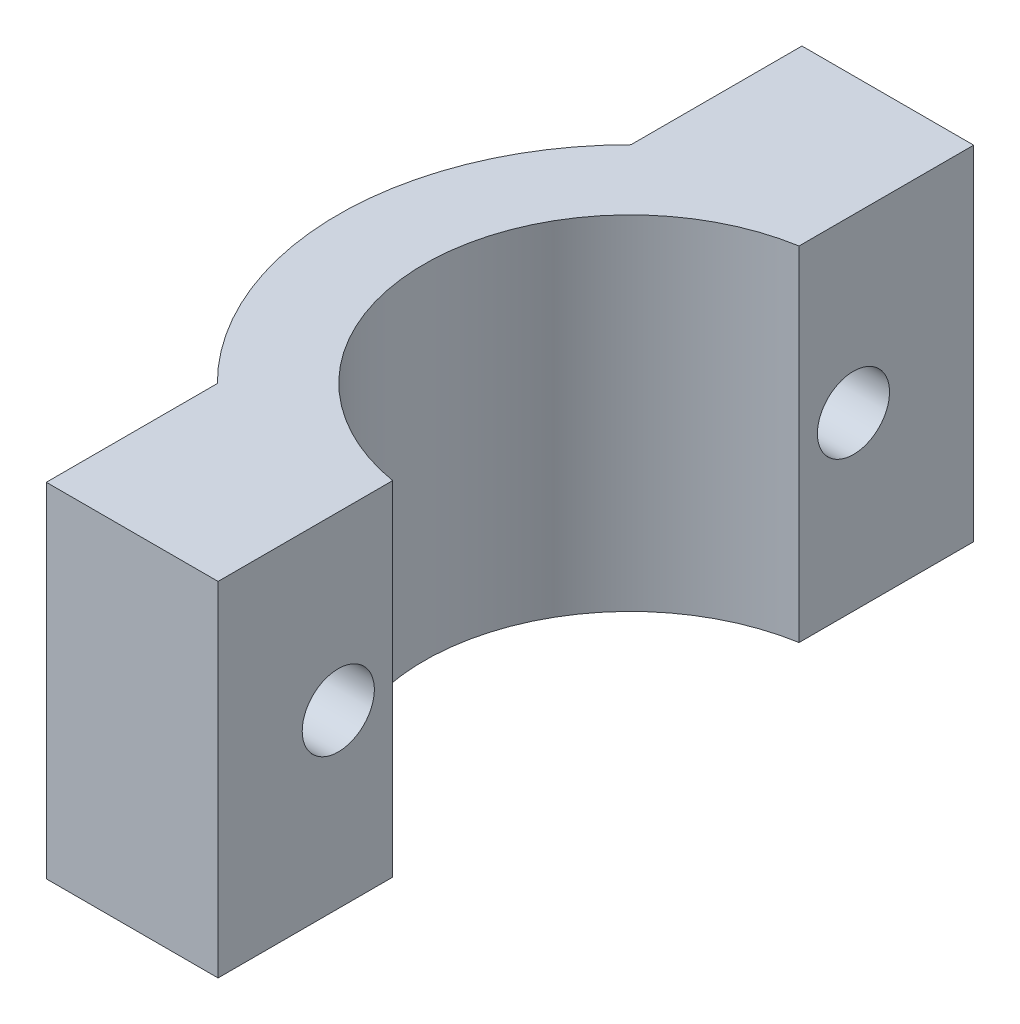
ISO-10303-21;
HEADER;
FILE_DESCRIPTION(('STEP AP214'),'2;1');
FILE_NAME('part.step','',(''),(''),'','','');
FILE_SCHEMA(('AUTOMOTIVE_DESIGN { 1 0 10303 214 1 1 1 1 }'));
ENDSEC;
DATA;
#1=APPLICATION_CONTEXT('core data for automotive mechanical design processes');
#2=APPLICATION_PROTOCOL_DEFINITION('international standard','automotive_design',2000,#1);
#3=PRODUCT_CONTEXT('',#1,'mechanical');
#4=PRODUCT('Part','Part','',(#3));
#5=PRODUCT_RELATED_PRODUCT_CATEGORY('part','',(#4));
#6=PRODUCT_DEFINITION_FORMATION('','',#4);
#7=PRODUCT_DEFINITION_CONTEXT('part definition',#1,'design');
#8=PRODUCT_DEFINITION('design','',#6,#7);
#9=PRODUCT_DEFINITION_SHAPE('','',#8);
#10=(LENGTH_UNIT() NAMED_UNIT(*) SI_UNIT(.MILLI.,.METRE.));
#11=(NAMED_UNIT(*) PLANE_ANGLE_UNIT() SI_UNIT($,.RADIAN.));
#12=(NAMED_UNIT(*) SI_UNIT($,.STERADIAN.) SOLID_ANGLE_UNIT());
#13=UNCERTAINTY_MEASURE_WITH_UNIT(LENGTH_MEASURE(1.E-05),#10,'distance_accuracy_value','');
#14=(GEOMETRIC_REPRESENTATION_CONTEXT(3) GLOBAL_UNCERTAINTY_ASSIGNED_CONTEXT((#13)) GLOBAL_UNIT_ASSIGNED_CONTEXT((#10,
#11,#12)) REPRESENTATION_CONTEXT('',''));
#15=CARTESIAN_POINT('',(0.,0.,0.));
#16=DIRECTION('',(0.,0.,1.));
#17=DIRECTION('',(1.,0.,0.));
#18=AXIS2_PLACEMENT_3D('',#15,#16,#17);
#19=CARTESIAN_POINT('',(0.,-10.,0.));
#20=DIRECTION('',(0.,1.,0.));
#21=DIRECTION('',(0.,0.,1.));
#22=AXIS2_PLACEMENT_3D('',#19,#20,#21);
#23=CYLINDRICAL_SURFACE('',#22,8.5);
#24=DIRECTION('',(0.,1.,0.));
#25=VECTOR('',#24,1.);
#26=CARTESIAN_POINT('',(-6.,-10.,6.02079728939615));
#27=LINE('',#26,#25);
#28=CARTESIAN_POINT('',(-6.,-10.,6.02079728939615));
#29=VERTEX_POINT('',#28);
#30=CARTESIAN_POINT('',(-6.,-5.93512530761509,6.02079728939615));
#31=VERTEX_POINT('',#30);
#32=EDGE_CURVE('E151',#29,#31,#27,.T.);
#33=ORIENTED_EDGE('',*,*,#32,.T.);
#34=CARTESIAN_POINT('',(-6.,-5.93512530761509,6.02079728939615));
#35=CARTESIAN_POINT('',(-6.01890510566342,-5.90532397248156,6.00195813734694));
#36=CARTESIAN_POINT('',(-6.03696524696629,-5.87457789174661,5.98378220843723));
#37=CARTESIAN_POINT('',(-6.07127946692325,-5.81123007359404,5.948963072947));
#38=CARTESIAN_POINT('',(-6.08753220054902,-5.7786269811582,5.93232100938724));
#39=CARTESIAN_POINT('',(-6.13346311327952,-5.67793536417979,5.8849444635135));
#40=CARTESIAN_POINT('',(-6.16019030254489,-5.60715749174834,5.85688406402757));
#41=CARTESIAN_POINT('',(-6.20474960564437,-5.45964836431623,5.80966046338005));
#42=CARTESIAN_POINT('',(-6.22254153833762,-5.38289197825015,5.79053747931254));
#43=CARTESIAN_POINT('',(-6.24820334580322,-5.22603375060161,5.76283960233543));
#44=CARTESIAN_POINT('',(-6.25609643266191,-5.14594019228052,5.7542400339212));
#45=CARTESIAN_POINT('',(-6.26144139142878,-4.99066999759935,5.74842259236815));
#46=CARTESIAN_POINT('',(-6.25958927462341,-4.91554421357168,5.75044599332987));
#47=CARTESIAN_POINT('',(-6.24711628416857,-4.7668589972804,5.76399346657525));
#48=CARTESIAN_POINT('',(-6.23649066070885,-4.69330043561417,5.77552268512352));
#49=CARTESIAN_POINT('',(-6.20727794843572,-4.55158375791139,5.80690466925131));
#50=CARTESIAN_POINT('',(-6.18888659305042,-4.48333872585438,5.82655256093744));
#51=CARTESIAN_POINT('',(-6.14485259415544,-4.35181679647583,5.87297211790871));
#52=CARTESIAN_POINT('',(-6.11921104382494,-4.28853915201148,5.89974270920243));
#53=CARTESIAN_POINT('',(-6.07668092134743,-4.19962106663739,5.94342786825054));
#54=CARTESIAN_POINT('',(-6.06225929621619,-4.17165376644763,5.95814341935982));
#55=CARTESIAN_POINT('',(-6.03210044742424,-4.11718282057263,5.98867466781519));
#56=CARTESIAN_POINT('',(-6.01636690182235,-4.09067540730923,6.00448726987407));
#57=CARTESIAN_POINT('',(-6.,-4.06487469238491,6.02079728939615));
#58=B_SPLINE_CURVE_WITH_KNOTS('',3,(#34,#35,#36,#37,#38,#39,#40,#41,#42,#43,#44,#45,#46,#47,#48,
#49,#50,#51,#52,#53,#54,#55,#56,#57),.UNSPECIFIED.,.F.,.F.,(4,2,2,2,2,2,2,2,2,2,2,4),(0.,
0.11996874544207,0.24002617953377,0.480915165461537,0.72287792173042,0.964272225228778,
1.18867058047496,1.41319050045353,1.63236070074663,1.85149787232062,1.95565066631469,
2.05952069266271),.UNSPECIFIED.);
#59=CARTESIAN_POINT('',(-6.,-4.06487469238491,6.02079728939615));
#60=VERTEX_POINT('',#59);
#61=EDGE_CURVE('E86',#31,#60,#58,.T.);
#62=ORIENTED_EDGE('',*,*,#61,.T.);
#63=CARTESIAN_POINT('',(-6.,0.,6.02079728939615));
#64=VERTEX_POINT('',#63);
#65=EDGE_CURVE('E148',#60,#64,#27,.T.);
#66=ORIENTED_EDGE('',*,*,#65,.T.);
#67=CARTESIAN_POINT('',(0.,0.,0.));
#68=DIRECTION('',(0.,1.,0.));
#69=DIRECTION('',(0.,0.,1.));
#70=AXIS2_PLACEMENT_3D('',#67,#68,#69);
#71=CIRCLE('',#70,8.5);
#72=CARTESIAN_POINT('',(-6.,0.,-6.02079728939615));
#73=VERTEX_POINT('',#72);
#74=EDGE_CURVE('E174',#73,#64,#71,.T.);
#75=ORIENTED_EDGE('',*,*,#74,.F.);
#76=DIRECTION('',(0.,1.,0.));
#77=VECTOR('',#76,1.);
#78=CARTESIAN_POINT('',(-6.,-10.,-6.02079728939615));
#79=LINE('',#78,#77);
#80=CARTESIAN_POINT('',(-6.,-4.06487469238491,-6.02079728939615));
#81=VERTEX_POINT('',#80);
#82=EDGE_CURVE('E241',#81,#73,#79,.T.);
#83=ORIENTED_EDGE('',*,*,#82,.F.);
#84=CARTESIAN_POINT('',(-6.,-4.06487469238491,-6.02079728939615));
#85=CARTESIAN_POINT('',(-6.01890510566342,-4.09467602751844,-6.00195813734694));
#86=CARTESIAN_POINT('',(-6.03696524696629,-4.12542210825339,-5.98378220843723));
#87=CARTESIAN_POINT('',(-6.07127946692325,-4.18876992640596,-5.948963072947));
#88=CARTESIAN_POINT('',(-6.08753220054902,-4.2213730188418,-5.93232100938724));
#89=CARTESIAN_POINT('',(-6.13346311327953,-4.32206463582021,-5.8849444635135));
#90=CARTESIAN_POINT('',(-6.16019030254489,-4.39284250825166,-5.85688406402757));
#91=CARTESIAN_POINT('',(-6.20474960564437,-4.54035163568377,-5.80966046338005));
#92=CARTESIAN_POINT('',(-6.22254153833762,-4.61710802174985,-5.79053747931254));
#93=CARTESIAN_POINT('',(-6.24820334580322,-4.77396624939839,-5.76283960233543));
#94=CARTESIAN_POINT('',(-6.25609643266191,-4.85405980771948,-5.7542400339212));
#95=CARTESIAN_POINT('',(-6.26144139142878,-5.00933000240065,-5.74842259236815));
#96=CARTESIAN_POINT('',(-6.25958927462341,-5.08445578642832,-5.75044599332987));
#97=CARTESIAN_POINT('',(-6.24711628416857,-5.2331410027196,-5.76399346657525));
#98=CARTESIAN_POINT('',(-6.23649066070885,-5.30669956438583,-5.77552268512352));
#99=CARTESIAN_POINT('',(-6.20727794843572,-5.4484162420886,-5.80690466925131));
#100=CARTESIAN_POINT('',(-6.18888659305042,-5.51666127414562,-5.82655256093744));
#101=CARTESIAN_POINT('',(-6.14485259415544,-5.64818320352416,-5.87297211790871));
#102=CARTESIAN_POINT('',(-6.11921104382494,-5.71146084798852,-5.89974270920243));
#103=CARTESIAN_POINT('',(-6.07668092134743,-5.80037893336261,-5.94342786825054));
#104=CARTESIAN_POINT('',(-6.06225929621619,-5.82834623355237,-5.95814341935982));
#105=CARTESIAN_POINT('',(-6.03210044742424,-5.88281717942737,-5.98867466781519));
#106=CARTESIAN_POINT('',(-6.01636690182235,-5.90932459269077,-6.00448726987407));
#107=CARTESIAN_POINT('',(-6.,-5.93512530761509,-6.02079728939615));
#108=B_SPLINE_CURVE_WITH_KNOTS('',3,(#84,#85,#86,#87,#88,#89,#90,#91,#92,#93,#94,#95,#96,#97,
#98,#99,#100,#101,#102,#103,#104,#105,#106,#107),.UNSPECIFIED.,.F.,.F.,(4,2,2,2,2,2,2,2,2,2,2,
4),(0.,0.119968745442071,0.240026179533771,0.480915165461537,0.722877921730419,
0.964272225228779,1.18867058047496,1.41319050045353,1.63236070074663,1.85149787232062,
1.95565066631469,2.05952069266271),.UNSPECIFIED.);
#109=CARTESIAN_POINT('',(-6.,-5.93512530761509,-6.02079728939615));
#110=VERTEX_POINT('',#109);
#111=EDGE_CURVE('E80',#81,#110,#108,.T.);
#112=ORIENTED_EDGE('',*,*,#111,.T.);
#113=CARTESIAN_POINT('',(-6.,-10.,-6.02079728939615));
#114=VERTEX_POINT('',#113);
#115=EDGE_CURVE('E145',#114,#110,#79,.T.);
#116=ORIENTED_EDGE('',*,*,#115,.F.);
#117=CARTESIAN_POINT('',(0.,-10.,0.));
#118=DIRECTION('',(0.,1.,0.));
#119=DIRECTION('',(0.,0.,1.));
#120=AXIS2_PLACEMENT_3D('',#117,#118,#119);
#121=CIRCLE('',#120,8.5);
#122=EDGE_CURVE('E193',#114,#29,#121,.T.);
#123=ORIENTED_EDGE('',*,*,#122,.T.);
#124=EDGE_LOOP('',(#33,#62,#66,#75,#83,#112,#116,#123));
#125=FACE_BOUND('',#124,.T.);
#126=ADVANCED_FACE('F65',(#125),#23,.T.);
#127=CARTESIAN_POINT('',(-6.,-10.,0.));
#128=DIRECTION('',(-1.,0.,0.));
#129=DIRECTION('',(0.,0.,1.));
#130=AXIS2_PLACEMENT_3D('',#127,#128,#129);
#131=PLANE('',#130);
#132=ORIENTED_EDGE('',*,*,#115,.T.);
#133=CARTESIAN_POINT('',(-6.,-5.,-7.5));
#134=DIRECTION('',(-1.,0.,0.));
#135=DIRECTION('',(0.,0.,1.));
#136=AXIS2_PLACEMENT_3D('',#133,#134,#135);
#137=CIRCLE('',#136,1.75);
#138=EDGE_CURVE('E12',#110,#81,#137,.F.);
#139=ORIENTED_EDGE('',*,*,#138,.T.);
#140=ORIENTED_EDGE('',*,*,#82,.T.);
#141=DIRECTION('',(0.,0.,1.));
#142=VECTOR('',#141,1.);
#143=CARTESIAN_POINT('',(-6.,0.,0.));
#144=LINE('',#143,#142);
#145=CARTESIAN_POINT('',(-6.,0.,-11.));
#146=VERTEX_POINT('',#145);
#147=EDGE_CURVE('E197',#146,#73,#144,.T.);
#148=ORIENTED_EDGE('',*,*,#147,.F.);
#149=DIRECTION('',(0.,1.,0.));
#150=VECTOR('',#149,1.);
#151=CARTESIAN_POINT('',(-6.,-10.,-11.));
#152=LINE('',#151,#150);
#153=CARTESIAN_POINT('',(-6.,-10.,-11.));
#154=VERTEX_POINT('',#153);
#155=EDGE_CURVE('E242',#154,#146,#152,.T.);
#156=ORIENTED_EDGE('',*,*,#155,.F.);
#157=DIRECTION('',(0.,0.,1.));
#158=VECTOR('',#157,1.);
#159=CARTESIAN_POINT('',(-6.,-10.,0.));
#160=LINE('',#159,#158);
#161=EDGE_CURVE('E160',#154,#114,#160,.T.);
#162=ORIENTED_EDGE('',*,*,#161,.T.);
#163=EDGE_LOOP('',(#132,#139,#140,#148,#156,#162));
#164=FACE_BOUND('',#163,.T.);
#165=ADVANCED_FACE('F273',(#164),#131,.T.);
#166=CARTESIAN_POINT('',(-6.,-10.,0.));
#167=DIRECTION('',(-1.,0.,0.));
#168=DIRECTION('',(0.,0.,1.));
#169=AXIS2_PLACEMENT_3D('',#166,#167,#168);
#170=PLANE('',#169);
#171=ORIENTED_EDGE('',*,*,#65,.F.);
#172=CARTESIAN_POINT('',(-6.,-5.,7.5));
#173=DIRECTION('',(-1.,0.,0.));
#174=DIRECTION('',(0.,0.,1.));
#175=AXIS2_PLACEMENT_3D('',#172,#173,#174);
#176=CIRCLE('',#175,1.75);
#177=EDGE_CURVE('E74',#60,#31,#176,.F.);
#178=ORIENTED_EDGE('',*,*,#177,.T.);
#179=ORIENTED_EDGE('',*,*,#32,.F.);
#180=DIRECTION('',(0.,0.,1.));
#181=VECTOR('',#180,1.);
#182=CARTESIAN_POINT('',(-6.,-10.,0.));
#183=LINE('',#182,#181);
#184=CARTESIAN_POINT('',(-6.,-10.,11.));
#185=VERTEX_POINT('',#184);
#186=EDGE_CURVE('E196',#29,#185,#183,.T.);
#187=ORIENTED_EDGE('',*,*,#186,.T.);
#188=DIRECTION('',(0.,1.,0.));
#189=VECTOR('',#188,1.);
#190=CARTESIAN_POINT('',(-6.,-10.,11.));
#191=LINE('',#190,#189);
#192=CARTESIAN_POINT('',(-6.,0.,11.));
#193=VERTEX_POINT('',#192);
#194=EDGE_CURVE('E164',#185,#193,#191,.T.);
#195=ORIENTED_EDGE('',*,*,#194,.T.);
#196=DIRECTION('',(0.,0.,1.));
#197=VECTOR('',#196,1.);
#198=CARTESIAN_POINT('',(-6.,0.,0.));
#199=LINE('',#198,#197);
#200=EDGE_CURVE('E157',#64,#193,#199,.T.);
#201=ORIENTED_EDGE('',*,*,#200,.F.);
#202=EDGE_LOOP('',(#171,#178,#179,#187,#195,#201));
#203=FACE_BOUND('',#202,.T.);
#204=ADVANCED_FACE('F155',(#203),#170,.T.);
#205=CARTESIAN_POINT('',(-8.5,-5.,7.5));
#206=DIRECTION('',(1.,0.,0.));
#207=DIRECTION('',(0.,0.,-1.));
#208=AXIS2_PLACEMENT_3D('',#205,#206,#207);
#209=CYLINDRICAL_SURFACE('',#208,1.05);
#210=CARTESIAN_POINT('',(-1.,-5.,7.5));
#211=DIRECTION('',(-1.,0.,0.));
#212=DIRECTION('',(0.,0.,1.));
#213=AXIS2_PLACEMENT_3D('',#210,#211,#212);
#214=CIRCLE('',#213,1.05);
#215=CARTESIAN_POINT('',(-1.,-5.,8.55));
#216=VERTEX_POINT('',#215);
#217=EDGE_CURVE('E175',#216,#216,#214,.T.);
#218=ORIENTED_EDGE('',*,*,#217,.F.);
#219=EDGE_LOOP('',(#218));
#220=FACE_BOUND('',#219,.T.);
#221=CARTESIAN_POINT('',(-5.,-5.,7.5));
#222=DIRECTION('',(-1.,0.,0.));
#223=DIRECTION('',(0.,0.,1.));
#224=AXIS2_PLACEMENT_3D('',#221,#222,#223);
#225=CIRCLE('',#224,1.05);
#226=CARTESIAN_POINT('',(-5.,-5.,8.55));
#227=VERTEX_POINT('',#226);
#228=EDGE_CURVE('E283',#227,#227,#225,.T.);
#229=ORIENTED_EDGE('',*,*,#228,.T.);
#230=EDGE_LOOP('',(#229));
#231=FACE_BOUND('',#230,.T.);
#232=ADVANCED_FACE('F307',(#220,#231),#209,.F.);
#233=CARTESIAN_POINT('',(-8.5,-5.,-7.5));
#234=DIRECTION('',(1.,0.,0.));
#235=DIRECTION('',(0.,0.,-1.));
#236=AXIS2_PLACEMENT_3D('',#233,#234,#235);
#237=CYLINDRICAL_SURFACE('',#236,1.05);
#238=CARTESIAN_POINT('',(-1.,-5.,-7.5));
#239=DIRECTION('',(-1.,0.,0.));
#240=DIRECTION('',(0.,0.,1.));
#241=AXIS2_PLACEMENT_3D('',#238,#239,#240);
#242=CIRCLE('',#241,1.05);
#243=CARTESIAN_POINT('',(-1.,-5.,-6.45));
#244=VERTEX_POINT('',#243);
#245=EDGE_CURVE('E171',#244,#244,#242,.T.);
#246=ORIENTED_EDGE('',*,*,#245,.F.);
#247=EDGE_LOOP('',(#246));
#248=FACE_BOUND('',#247,.T.);
#249=CARTESIAN_POINT('',(-5.,-5.,-7.5));
#250=DIRECTION('',(-1.,0.,0.));
#251=DIRECTION('',(0.,0.,1.));
#252=AXIS2_PLACEMENT_3D('',#249,#250,#251);
#253=CIRCLE('',#252,1.05);
#254=CARTESIAN_POINT('',(-5.,-5.,-6.45));
#255=VERTEX_POINT('',#254);
#256=EDGE_CURVE('E284',#255,#255,#253,.T.);
#257=ORIENTED_EDGE('',*,*,#256,.T.);
#258=EDGE_LOOP('',(#257));
#259=FACE_BOUND('',#258,.T.);
#260=ADVANCED_FACE('F310',(#248,#259),#237,.F.);
#261=CARTESIAN_POINT('',(0.,-10.,-11.));
#262=DIRECTION('',(0.,0.,1.));
#263=DIRECTION('',(1.,0.,0.));
#264=AXIS2_PLACEMENT_3D('',#261,#262,#263);
#265=PLANE('',#264);
#266=DIRECTION('',(1.,0.,0.));
#267=VECTOR('',#266,1.);
#268=CARTESIAN_POINT('',(0.,0.,-11.));
#269=LINE('',#268,#267);
#270=CARTESIAN_POINT('',(-1.,0.,-11.));
#271=VERTEX_POINT('',#270);
#272=EDGE_CURVE('E232',#146,#271,#269,.T.);
#273=ORIENTED_EDGE('',*,*,#272,.T.);
#274=DIRECTION('',(0.,1.,0.));
#275=VECTOR('',#274,1.);
#276=CARTESIAN_POINT('',(-1.,-10.,-11.));
#277=LINE('',#276,#275);
#278=CARTESIAN_POINT('',(-1.,-10.,-11.));
#279=VERTEX_POINT('',#278);
#280=EDGE_CURVE('E245',#279,#271,#277,.T.);
#281=ORIENTED_EDGE('',*,*,#280,.F.);
#282=DIRECTION('',(1.,0.,0.));
#283=VECTOR('',#282,1.);
#284=CARTESIAN_POINT('',(0.,-10.,-11.));
#285=LINE('',#284,#283);
#286=EDGE_CURVE('E166',#154,#279,#285,.T.);
#287=ORIENTED_EDGE('',*,*,#286,.F.);
#288=ORIENTED_EDGE('',*,*,#155,.T.);
#289=EDGE_LOOP('',(#273,#281,#287,#288));
#290=FACE_BOUND('',#289,.T.);
#291=ADVANCED_FACE('F314',(#290),#265,.F.);
#292=CARTESIAN_POINT('',(-1.,-10.,0.));
#293=DIRECTION('',(-1.,0.,0.));
#294=DIRECTION('',(0.,0.,1.));
#295=AXIS2_PLACEMENT_3D('',#292,#293,#294);
#296=PLANE('',#295);
#297=ORIENTED_EDGE('',*,*,#245,.T.);
#298=EDGE_LOOP('',(#297));
#299=FACE_BOUND('',#298,.T.);
#300=DIRECTION('',(0.,0.,1.));
#301=VECTOR('',#300,1.);
#302=CARTESIAN_POINT('',(-1.,0.,0.));
#303=LINE('',#302,#301);
#304=CARTESIAN_POINT('',(-1.,0.,-5.91607978309962));
#305=VERTEX_POINT('',#304);
#306=EDGE_CURVE('E229',#271,#305,#303,.T.);
#307=ORIENTED_EDGE('',*,*,#306,.T.);
#308=DIRECTION('',(0.,1.,0.));
#309=VECTOR('',#308,1.);
#310=CARTESIAN_POINT('',(-1.,-10.,-5.91607978309962));
#311=LINE('',#310,#309);
#312=CARTESIAN_POINT('',(-1.,-10.,-5.91607978309962));
#313=VERTEX_POINT('',#312);
#314=EDGE_CURVE('E249',#313,#305,#311,.T.);
#315=ORIENTED_EDGE('',*,*,#314,.F.);
#316=DIRECTION('',(0.,0.,1.));
#317=VECTOR('',#316,1.);
#318=CARTESIAN_POINT('',(-1.,-10.,0.));
#319=LINE('',#318,#317);
#320=EDGE_CURVE('E211',#279,#313,#319,.T.);
#321=ORIENTED_EDGE('',*,*,#320,.F.);
#322=ORIENTED_EDGE('',*,*,#280,.T.);
#323=EDGE_LOOP('',(#307,#315,#321,#322));
#324=FACE_BOUND('',#323,.T.);
#325=ADVANCED_FACE('F326',(#299,#324),#296,.F.);
#326=CARTESIAN_POINT('',(0.,-10.,0.));
#327=DIRECTION('',(0.,1.,0.));
#328=DIRECTION('',(0.,0.,1.));
#329=AXIS2_PLACEMENT_3D('',#326,#327,#328);
#330=CYLINDRICAL_SURFACE('',#329,6.);
#331=CARTESIAN_POINT('',(0.,0.,0.));
#332=DIRECTION('',(0.,1.,0.));
#333=DIRECTION('',(0.,0.,1.));
#334=AXIS2_PLACEMENT_3D('',#331,#332,#333);
#335=CIRCLE('',#334,6.);
#336=CARTESIAN_POINT('',(-1.,0.,5.91607978309962));
#337=VERTEX_POINT('',#336);
#338=EDGE_CURVE('E226',#305,#337,#335,.T.);
#339=ORIENTED_EDGE('',*,*,#338,.T.);
#340=DIRECTION('',(0.,1.,0.));
#341=VECTOR('',#340,1.);
#342=CARTESIAN_POINT('',(-1.,-10.,5.91607978309962));
#343=LINE('',#342,#341);
#344=CARTESIAN_POINT('',(-1.,-10.,5.91607978309962));
#345=VERTEX_POINT('',#344);
#346=EDGE_CURVE('E253',#345,#337,#343,.T.);
#347=ORIENTED_EDGE('',*,*,#346,.F.);
#348=CARTESIAN_POINT('',(0.,-10.,0.));
#349=DIRECTION('',(0.,1.,0.));
#350=DIRECTION('',(0.,0.,1.));
#351=AXIS2_PLACEMENT_3D('',#348,#349,#350);
#352=CIRCLE('',#351,6.);
#353=EDGE_CURVE('E208',#313,#345,#352,.T.);
#354=ORIENTED_EDGE('',*,*,#353,.F.);
#355=ORIENTED_EDGE('',*,*,#314,.T.);
#356=EDGE_LOOP('',(#339,#347,#354,#355));
#357=FACE_BOUND('',#356,.T.);
#358=ADVANCED_FACE('F330',(#357),#330,.F.);
#359=CARTESIAN_POINT('',(-1.,-10.,0.));
#360=DIRECTION('',(-1.,0.,0.));
#361=DIRECTION('',(0.,0.,1.));
#362=AXIS2_PLACEMENT_3D('',#359,#360,#361);
#363=PLANE('',#362);
#364=ORIENTED_EDGE('',*,*,#217,.T.);
#365=EDGE_LOOP('',(#364));
#366=FACE_BOUND('',#365,.T.);
#367=DIRECTION('',(0.,0.,1.));
#368=VECTOR('',#367,1.);
#369=CARTESIAN_POINT('',(-1.,0.,0.));
#370=LINE('',#369,#368);
#371=CARTESIAN_POINT('',(-0.999999999999999,0.,11.));
#372=VERTEX_POINT('',#371);
#373=EDGE_CURVE('E222',#337,#372,#370,.T.);
#374=ORIENTED_EDGE('',*,*,#373,.T.);
#375=DIRECTION('',(0.,1.,0.));
#376=VECTOR('',#375,1.);
#377=CARTESIAN_POINT('',(-0.999999999999999,-10.,11.));
#378=LINE('',#377,#376);
#379=CARTESIAN_POINT('',(-0.999999999999999,-10.,11.));
#380=VERTEX_POINT('',#379);
#381=EDGE_CURVE('E256',#380,#372,#378,.T.);
#382=ORIENTED_EDGE('',*,*,#381,.F.);
#383=DIRECTION('',(0.,0.,1.));
#384=VECTOR('',#383,1.);
#385=CARTESIAN_POINT('',(-1.,-10.,0.));
#386=LINE('',#385,#384);
#387=EDGE_CURVE('E205',#345,#380,#386,.T.);
#388=ORIENTED_EDGE('',*,*,#387,.F.);
#389=ORIENTED_EDGE('',*,*,#346,.T.);
#390=EDGE_LOOP('',(#374,#382,#388,#389));
#391=FACE_BOUND('',#390,.T.);
#392=ADVANCED_FACE('F333',(#366,#391),#363,.F.);
#393=CARTESIAN_POINT('',(0.,-10.,11.));
#394=DIRECTION('',(0.,0.,1.));
#395=DIRECTION('',(1.,0.,0.));
#396=AXIS2_PLACEMENT_3D('',#393,#394,#395);
#397=PLANE('',#396);
#398=DIRECTION('',(1.,0.,0.));
#399=VECTOR('',#398,1.);
#400=CARTESIAN_POINT('',(0.,0.,11.));
#401=LINE('',#400,#399);
#402=EDGE_CURVE('E218',#193,#372,#401,.T.);
#403=ORIENTED_EDGE('',*,*,#402,.F.);
#404=ORIENTED_EDGE('',*,*,#194,.F.);
#405=DIRECTION('',(1.,0.,0.));
#406=VECTOR('',#405,1.);
#407=CARTESIAN_POINT('',(0.,-10.,11.));
#408=LINE('',#407,#406);
#409=EDGE_CURVE('E201',#185,#380,#408,.T.);
#410=ORIENTED_EDGE('',*,*,#409,.T.);
#411=ORIENTED_EDGE('',*,*,#381,.T.);
#412=EDGE_LOOP('',(#403,#404,#410,#411));
#413=FACE_BOUND('',#412,.T.);
#414=ADVANCED_FACE('F264',(#413),#397,.T.);
#415=CARTESIAN_POINT('',(0.,-10.,0.));
#416=DIRECTION('',(0.,1.,0.));
#417=DIRECTION('',(0.,0.,1.));
#418=AXIS2_PLACEMENT_3D('',#415,#416,#417);
#419=PLANE('',#418);
#420=ORIENTED_EDGE('',*,*,#122,.F.);
#421=ORIENTED_EDGE('',*,*,#161,.F.);
#422=ORIENTED_EDGE('',*,*,#286,.T.);
#423=ORIENTED_EDGE('',*,*,#320,.T.);
#424=ORIENTED_EDGE('',*,*,#353,.T.);
#425=ORIENTED_EDGE('',*,*,#387,.T.);
#426=ORIENTED_EDGE('',*,*,#409,.F.);
#427=ORIENTED_EDGE('',*,*,#186,.F.);
#428=EDGE_LOOP('',(#420,#421,#422,#423,#424,#425,#426,#427));
#429=FACE_BOUND('',#428,.T.);
#430=ADVANCED_FACE('F316',(#429),#419,.F.);
#431=CARTESIAN_POINT('',(0.,0.,0.));
#432=DIRECTION('',(0.,1.,0.));
#433=DIRECTION('',(0.,0.,1.));
#434=AXIS2_PLACEMENT_3D('',#431,#432,#433);
#435=PLANE('',#434);
#436=ORIENTED_EDGE('',*,*,#74,.T.);
#437=ORIENTED_EDGE('',*,*,#200,.T.);
#438=ORIENTED_EDGE('',*,*,#402,.T.);
#439=ORIENTED_EDGE('',*,*,#373,.F.);
#440=ORIENTED_EDGE('',*,*,#338,.F.);
#441=ORIENTED_EDGE('',*,*,#306,.F.);
#442=ORIENTED_EDGE('',*,*,#272,.F.);
#443=ORIENTED_EDGE('',*,*,#147,.T.);
#444=EDGE_LOOP('',(#436,#437,#438,#439,#440,#441,#442,#443));
#445=FACE_BOUND('',#444,.T.);
#446=ADVANCED_FACE('F267',(#445),#435,.T.);
#447=CARTESIAN_POINT('',(-16.,-5.,-7.5));
#448=DIRECTION('',(1.,0.,0.));
#449=DIRECTION('',(0.,0.,-1.));
#450=AXIS2_PLACEMENT_3D('',#447,#448,#449);
#451=CYLINDRICAL_SURFACE('',#450,1.75);
#452=ORIENTED_EDGE('',*,*,#138,.F.);
#453=ORIENTED_EDGE('',*,*,#111,.F.);
#454=EDGE_LOOP('',(#452,#453));
#455=FACE_BOUND('',#454,.T.);
#456=CARTESIAN_POINT('',(-5.,-5.,-7.5));
#457=DIRECTION('',(-1.,0.,0.));
#458=DIRECTION('',(0.,0.,1.));
#459=AXIS2_PLACEMENT_3D('',#456,#457,#458);
#460=CIRCLE('',#459,1.75);
#461=CARTESIAN_POINT('',(-5.,-5.,-5.75));
#462=VERTEX_POINT('',#461);
#463=EDGE_CURVE('E280',#462,#462,#460,.T.);
#464=ORIENTED_EDGE('',*,*,#463,.F.);
#465=EDGE_LOOP('',(#464));
#466=FACE_BOUND('',#465,.T.);
#467=ADVANCED_FACE('F274',(#455,#466),#451,.F.);
#468=CARTESIAN_POINT('',(-5.,-5.,-7.5));
#469=DIRECTION('',(-1.,0.,0.));
#470=DIRECTION('',(0.,0.,1.));
#471=AXIS2_PLACEMENT_3D('',#468,#469,#470);
#472=PLANE('',#471);
#473=ORIENTED_EDGE('',*,*,#256,.F.);
#474=EDGE_LOOP('',(#473));
#475=FACE_BOUND('',#474,.T.);
#476=ORIENTED_EDGE('',*,*,#463,.T.);
#477=EDGE_LOOP('',(#476));
#478=FACE_BOUND('',#477,.T.);
#479=ADVANCED_FACE('F277',(#475,#478),#472,.T.);
#480=CARTESIAN_POINT('',(-16.,-5.,7.5));
#481=DIRECTION('',(1.,0.,0.));
#482=DIRECTION('',(0.,0.,-1.));
#483=AXIS2_PLACEMENT_3D('',#480,#481,#482);
#484=CYLINDRICAL_SURFACE('',#483,1.75);
#485=ORIENTED_EDGE('',*,*,#177,.F.);
#486=ORIENTED_EDGE('',*,*,#61,.F.);
#487=EDGE_LOOP('',(#485,#486));
#488=FACE_BOUND('',#487,.T.);
#489=CARTESIAN_POINT('',(-5.,-5.,7.5));
#490=DIRECTION('',(-1.,0.,0.));
#491=DIRECTION('',(0.,0.,1.));
#492=AXIS2_PLACEMENT_3D('',#489,#490,#491);
#493=CIRCLE('',#492,1.75);
#494=CARTESIAN_POINT('',(-5.,-5.,9.25));
#495=VERTEX_POINT('',#494);
#496=EDGE_CURVE('E153',#495,#495,#493,.T.);
#497=ORIENTED_EDGE('',*,*,#496,.F.);
#498=EDGE_LOOP('',(#497));
#499=FACE_BOUND('',#498,.T.);
#500=ADVANCED_FACE('F139',(#488,#499),#484,.F.);
#501=CARTESIAN_POINT('',(-5.,-5.,7.5));
#502=DIRECTION('',(-1.,0.,0.));
#503=DIRECTION('',(0.,0.,1.));
#504=AXIS2_PLACEMENT_3D('',#501,#502,#503);
#505=PLANE('',#504);
#506=ORIENTED_EDGE('',*,*,#228,.F.);
#507=EDGE_LOOP('',(#506));
#508=FACE_BOUND('',#507,.T.);
#509=ORIENTED_EDGE('',*,*,#496,.T.);
#510=EDGE_LOOP('',(#509));
#511=FACE_BOUND('',#510,.T.);
#512=ADVANCED_FACE('F302',(#508,#511),#505,.T.);
#513=CLOSED_SHELL('',(#126,#165,#204,#232,#260,#291,#325,#358,#392,#414,#430,#446,#467,#479,
#500,#512));
#514=MANIFOLD_SOLID_BREP('B2',#513);
#515=ADVANCED_BREP_SHAPE_REPRESENTATION('',(#18,#514),#14);
#516=SHAPE_DEFINITION_REPRESENTATION(#9,#515);
ENDSEC;
END-ISO-10303-21;
